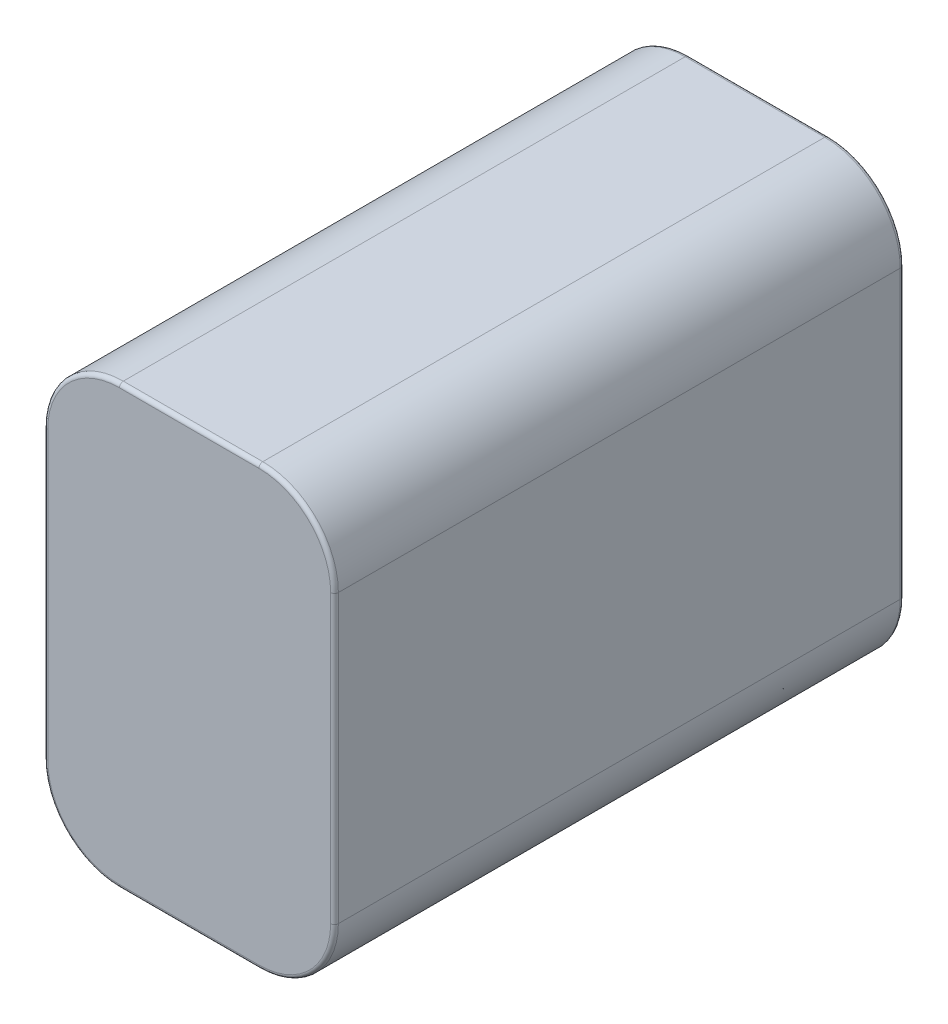
ISO-10303-21;
HEADER;
FILE_DESCRIPTION(('STEP AP214'),'2;1');
FILE_NAME('part.step','',(''),(''),'','','');
FILE_SCHEMA(('AUTOMOTIVE_DESIGN { 1 0 10303 214 1 1 1 1 }'));
ENDSEC;
DATA;
#1=APPLICATION_CONTEXT('core data for automotive mechanical design processes');
#2=APPLICATION_PROTOCOL_DEFINITION('international standard','automotive_design',2000,#1);
#3=PRODUCT_CONTEXT('',#1,'mechanical');
#4=PRODUCT('Part','Part','',(#3));
#5=PRODUCT_RELATED_PRODUCT_CATEGORY('part','',(#4));
#6=PRODUCT_DEFINITION_FORMATION('','',#4);
#7=PRODUCT_DEFINITION_CONTEXT('part definition',#1,'design');
#8=PRODUCT_DEFINITION('design','',#6,#7);
#9=PRODUCT_DEFINITION_SHAPE('','',#8);
#10=(LENGTH_UNIT() NAMED_UNIT(*) SI_UNIT(.MILLI.,.METRE.));
#11=(NAMED_UNIT(*) PLANE_ANGLE_UNIT() SI_UNIT($,.RADIAN.));
#12=(NAMED_UNIT(*) SI_UNIT($,.STERADIAN.) SOLID_ANGLE_UNIT());
#13=UNCERTAINTY_MEASURE_WITH_UNIT(LENGTH_MEASURE(1.E-05),#10,'distance_accuracy_value','');
#14=(GEOMETRIC_REPRESENTATION_CONTEXT(3) GLOBAL_UNCERTAINTY_ASSIGNED_CONTEXT((#13)) GLOBAL_UNIT_ASSIGNED_CONTEXT((#10,
#11,#12)) REPRESENTATION_CONTEXT('',''));
#15=CARTESIAN_POINT('',(0.,0.,0.));
#16=DIRECTION('',(0.,0.,1.));
#17=DIRECTION('',(1.,0.,0.));
#18=AXIS2_PLACEMENT_3D('',#15,#16,#17);
#19=CARTESIAN_POINT('',(0.,18.5,0.75));
#20=DIRECTION('',(0.,0.,-1.));
#21=DIRECTION('',(-1.,0.,0.));
#22=AXIS2_PLACEMENT_3D('',#19,#20,#21);
#23=CYLINDRICAL_SURFACE('',#22,9.75);
#24=DIRECTION('',(0.,0.,-1.));
#25=VECTOR('',#24,1.);
#26=CARTESIAN_POINT('',(-9.75000000000001,18.5,0.75));
#27=LINE('',#26,#25);
#28=CARTESIAN_POINT('',(-9.75000000000001,18.5,0.25));
#29=VERTEX_POINT('',#28);
#30=CARTESIAN_POINT('',(-9.75000000000001,18.5,-72.25));
#31=VERTEX_POINT('',#30);
#32=EDGE_CURVE('E281',#29,#31,#27,.T.);
#33=ORIENTED_EDGE('',*,*,#32,.F.);
#34=CARTESIAN_POINT('',(0.,18.5,0.25));
#35=DIRECTION('',(0.,0.,-1.));
#36=DIRECTION('',(-1.,0.,0.));
#37=AXIS2_PLACEMENT_3D('',#34,#35,#36);
#38=CIRCLE('',#37,9.75);
#39=CARTESIAN_POINT('',(0.,28.25,0.25));
#40=VERTEX_POINT('',#39);
#41=EDGE_CURVE('E333',#29,#40,#38,.T.);
#42=ORIENTED_EDGE('',*,*,#41,.T.);
#43=DIRECTION('',(0.,0.,-1.));
#44=VECTOR('',#43,1.);
#45=CARTESIAN_POINT('',(0.,28.25,0.75));
#46=LINE('',#45,#44);
#47=CARTESIAN_POINT('',(0.,28.25,-72.25));
#48=VERTEX_POINT('',#47);
#49=EDGE_CURVE('E260',#40,#48,#46,.T.);
#50=ORIENTED_EDGE('',*,*,#49,.T.);
#51=CARTESIAN_POINT('',(0.,18.5,-72.25));
#52=DIRECTION('',(0.,0.,-1.));
#53=DIRECTION('',(-1.,0.,0.));
#54=AXIS2_PLACEMENT_3D('',#51,#52,#53);
#55=CIRCLE('',#54,9.75);
#56=EDGE_CURVE('E331',#48,#31,#55,.F.);
#57=ORIENTED_EDGE('',*,*,#56,.T.);
#58=EDGE_LOOP('',(#33,#42,#50,#57));
#59=FACE_BOUND('',#58,.T.);
#60=ADVANCED_FACE('F37',(#59),#23,.T.);
#61=CARTESIAN_POINT('',(-9.75000000000001,-18.5,0.75));
#62=DIRECTION('',(1.,0.,0.));
#63=DIRECTION('',(0.,0.,-1.));
#64=AXIS2_PLACEMENT_3D('',#61,#62,#63);
#65=PLANE('',#64);
#66=DIRECTION('',(0.,0.,-1.));
#67=VECTOR('',#66,1.);
#68=CARTESIAN_POINT('',(-9.75000000000001,-18.5,0.75));
#69=LINE('',#68,#67);
#70=CARTESIAN_POINT('',(-9.75000000000001,-18.5,0.25));
#71=VERTEX_POINT('',#70);
#72=CARTESIAN_POINT('',(-9.75000000000001,-18.5,-72.25));
#73=VERTEX_POINT('',#72);
#74=EDGE_CURVE('E278',#71,#73,#69,.T.);
#75=ORIENTED_EDGE('',*,*,#74,.F.);
#76=DIRECTION('',(0.,-1.,0.));
#77=VECTOR('',#76,1.);
#78=CARTESIAN_POINT('',(-9.75000000000001,-18.5,0.25));
#79=LINE('',#78,#77);
#80=EDGE_CURVE('E329',#71,#29,#79,.F.);
#81=ORIENTED_EDGE('',*,*,#80,.T.);
#82=ORIENTED_EDGE('',*,*,#32,.T.);
#83=DIRECTION('',(0.,1.,0.));
#84=VECTOR('',#83,1.);
#85=CARTESIAN_POINT('',(-9.75000000000001,-18.5,-72.25));
#86=LINE('',#85,#84);
#87=EDGE_CURVE('E327',#31,#73,#86,.F.);
#88=ORIENTED_EDGE('',*,*,#87,.T.);
#89=EDGE_LOOP('',(#75,#81,#82,#88));
#90=FACE_BOUND('',#89,.T.);
#91=ADVANCED_FACE('F407',(#90),#65,.F.);
#92=CARTESIAN_POINT('',(0.,-18.5,0.75));
#93=DIRECTION('',(0.,0.,-1.));
#94=DIRECTION('',(-1.,0.,0.));
#95=AXIS2_PLACEMENT_3D('',#92,#93,#94);
#96=CYLINDRICAL_SURFACE('',#95,9.75);
#97=DIRECTION('',(0.,0.,-1.));
#98=VECTOR('',#97,1.);
#99=CARTESIAN_POINT('',(0.,-28.25,0.75));
#100=LINE('',#99,#98);
#101=CARTESIAN_POINT('',(0.,-28.25,0.25));
#102=VERTEX_POINT('',#101);
#103=CARTESIAN_POINT('',(0.,-28.25,-72.25));
#104=VERTEX_POINT('',#103);
#105=EDGE_CURVE('E275',#102,#104,#100,.T.);
#106=ORIENTED_EDGE('',*,*,#105,.F.);
#107=CARTESIAN_POINT('',(0.,-18.5,0.25));
#108=DIRECTION('',(0.,0.,-1.));
#109=DIRECTION('',(-1.,0.,0.));
#110=AXIS2_PLACEMENT_3D('',#107,#108,#109);
#111=CIRCLE('',#110,9.75);
#112=EDGE_CURVE('E325',#102,#71,#111,.T.);
#113=ORIENTED_EDGE('',*,*,#112,.T.);
#114=ORIENTED_EDGE('',*,*,#74,.T.);
#115=CARTESIAN_POINT('',(0.,-18.5,-72.25));
#116=DIRECTION('',(0.,0.,-1.));
#117=DIRECTION('',(-1.,0.,0.));
#118=AXIS2_PLACEMENT_3D('',#115,#116,#117);
#119=CIRCLE('',#118,9.75);
#120=EDGE_CURVE('E323',#73,#104,#119,.F.);
#121=ORIENTED_EDGE('',*,*,#120,.T.);
#122=EDGE_LOOP('',(#106,#113,#114,#121));
#123=FACE_BOUND('',#122,.T.);
#124=ADVANCED_FACE('F467',(#123),#96,.T.);
#125=CARTESIAN_POINT('',(0.,-28.25,0.75));
#126=DIRECTION('',(0.,1.,0.));
#127=DIRECTION('',(0.,0.,1.));
#128=AXIS2_PLACEMENT_3D('',#125,#126,#127);
#129=PLANE('',#128);
#130=DIRECTION('',(0.,0.,-1.));
#131=VECTOR('',#130,1.);
#132=CARTESIAN_POINT('',(18.,-28.25,0.75));
#133=LINE('',#132,#131);
#134=CARTESIAN_POINT('',(18.,-28.25,0.25));
#135=VERTEX_POINT('',#134);
#136=CARTESIAN_POINT('',(18.,-28.25,-72.25));
#137=VERTEX_POINT('',#136);
#138=EDGE_CURVE('E272',#135,#137,#133,.T.);
#139=ORIENTED_EDGE('',*,*,#138,.F.);
#140=DIRECTION('',(1.,0.,0.));
#141=VECTOR('',#140,1.);
#142=CARTESIAN_POINT('',(0.,-28.25,0.25));
#143=LINE('',#142,#141);
#144=EDGE_CURVE('E321',#135,#102,#143,.F.);
#145=ORIENTED_EDGE('',*,*,#144,.T.);
#146=ORIENTED_EDGE('',*,*,#105,.T.);
#147=DIRECTION('',(-1.,0.,0.));
#148=VECTOR('',#147,1.);
#149=CARTESIAN_POINT('',(18.,-28.25,-72.25));
#150=LINE('',#149,#148);
#151=EDGE_CURVE('E319',#104,#137,#150,.F.);
#152=ORIENTED_EDGE('',*,*,#151,.T.);
#153=EDGE_LOOP('',(#139,#145,#146,#152));
#154=FACE_BOUND('',#153,.T.);
#155=ADVANCED_FACE('F455',(#154),#129,.F.);
#156=CARTESIAN_POINT('',(18.,-18.5,0.75));
#157=DIRECTION('',(0.,0.,-1.));
#158=DIRECTION('',(-1.,0.,0.));
#159=AXIS2_PLACEMENT_3D('',#156,#157,#158);
#160=CYLINDRICAL_SURFACE('',#159,9.75);
#161=DIRECTION('',(0.,0.,-1.));
#162=VECTOR('',#161,1.);
#163=CARTESIAN_POINT('',(27.75,-18.5,0.75));
#164=LINE('',#163,#162);
#165=CARTESIAN_POINT('',(27.75,-18.5,0.25));
#166=VERTEX_POINT('',#165);
#167=CARTESIAN_POINT('',(27.75,-18.5,-72.25));
#168=VERTEX_POINT('',#167);
#169=EDGE_CURVE('E269',#166,#168,#164,.T.);
#170=ORIENTED_EDGE('',*,*,#169,.F.);
#171=CARTESIAN_POINT('',(18.,-18.5,0.25));
#172=DIRECTION('',(0.,0.,-1.));
#173=DIRECTION('',(-1.,0.,0.));
#174=AXIS2_PLACEMENT_3D('',#171,#172,#173);
#175=CIRCLE('',#174,9.75);
#176=EDGE_CURVE('E317',#166,#135,#175,.T.);
#177=ORIENTED_EDGE('',*,*,#176,.T.);
#178=ORIENTED_EDGE('',*,*,#138,.T.);
#179=CARTESIAN_POINT('',(18.,-18.5,-72.25));
#180=DIRECTION('',(0.,0.,-1.));
#181=DIRECTION('',(-1.,0.,0.));
#182=AXIS2_PLACEMENT_3D('',#179,#180,#181);
#183=CIRCLE('',#182,9.75);
#184=EDGE_CURVE('E314',#137,#168,#183,.F.);
#185=ORIENTED_EDGE('',*,*,#184,.T.);
#186=EDGE_LOOP('',(#170,#177,#178,#185));
#187=FACE_BOUND('',#186,.T.);
#188=ADVANCED_FACE('F451',(#187),#160,.T.);
#189=CARTESIAN_POINT('',(27.75,-18.5,0.75));
#190=DIRECTION('',(-1.,0.,0.));
#191=DIRECTION('',(0.,-1.,0.));
#192=AXIS2_PLACEMENT_3D('',#189,#190,#191);
#193=PLANE('',#192);
#194=DIRECTION('',(0.,0.,-1.));
#195=VECTOR('',#194,1.);
#196=CARTESIAN_POINT('',(27.75,18.5,0.75));
#197=LINE('',#196,#195);
#198=CARTESIAN_POINT('',(27.75,18.5,0.25));
#199=VERTEX_POINT('',#198);
#200=CARTESIAN_POINT('',(27.75,18.5,-72.25));
#201=VERTEX_POINT('',#200);
#202=EDGE_CURVE('E266',#199,#201,#197,.T.);
#203=ORIENTED_EDGE('',*,*,#202,.F.);
#204=DIRECTION('',(0.,1.,0.));
#205=VECTOR('',#204,1.);
#206=CARTESIAN_POINT('',(27.75,-18.5,0.25));
#207=LINE('',#206,#205);
#208=EDGE_CURVE('E312',#199,#166,#207,.F.);
#209=ORIENTED_EDGE('',*,*,#208,.T.);
#210=ORIENTED_EDGE('',*,*,#169,.T.);
#211=DIRECTION('',(0.,-1.,0.));
#212=VECTOR('',#211,1.);
#213=CARTESIAN_POINT('',(27.75,18.5,-72.25));
#214=LINE('',#213,#212);
#215=EDGE_CURVE('E310',#168,#201,#214,.F.);
#216=ORIENTED_EDGE('',*,*,#215,.T.);
#217=EDGE_LOOP('',(#203,#209,#210,#216));
#218=FACE_BOUND('',#217,.T.);
#219=ADVANCED_FACE('F437',(#218),#193,.F.);
#220=CARTESIAN_POINT('',(18.,18.5,0.75));
#221=DIRECTION('',(0.,0.,-1.));
#222=DIRECTION('',(-1.,0.,0.));
#223=AXIS2_PLACEMENT_3D('',#220,#221,#222);
#224=CYLINDRICAL_SURFACE('',#223,9.75);
#225=DIRECTION('',(0.,0.,-1.));
#226=VECTOR('',#225,1.);
#227=CARTESIAN_POINT('',(18.,28.25,0.75));
#228=LINE('',#227,#226);
#229=CARTESIAN_POINT('',(18.,28.25,0.25));
#230=VERTEX_POINT('',#229);
#231=CARTESIAN_POINT('',(18.,28.25,-72.25));
#232=VERTEX_POINT('',#231);
#233=EDGE_CURVE('E263',#230,#232,#228,.T.);
#234=ORIENTED_EDGE('',*,*,#233,.F.);
#235=CARTESIAN_POINT('',(18.,18.5,0.25));
#236=DIRECTION('',(0.,0.,-1.));
#237=DIRECTION('',(-1.,0.,0.));
#238=AXIS2_PLACEMENT_3D('',#235,#236,#237);
#239=CIRCLE('',#238,9.75);
#240=EDGE_CURVE('E308',#230,#199,#239,.T.);
#241=ORIENTED_EDGE('',*,*,#240,.T.);
#242=ORIENTED_EDGE('',*,*,#202,.T.);
#243=CARTESIAN_POINT('',(18.,18.5,-72.25));
#244=DIRECTION('',(0.,0.,-1.));
#245=DIRECTION('',(-1.,0.,0.));
#246=AXIS2_PLACEMENT_3D('',#243,#244,#245);
#247=CIRCLE('',#246,9.75);
#248=EDGE_CURVE('E306',#201,#232,#247,.F.);
#249=ORIENTED_EDGE('',*,*,#248,.T.);
#250=EDGE_LOOP('',(#234,#241,#242,#249));
#251=FACE_BOUND('',#250,.T.);
#252=ADVANCED_FACE('F433',(#251),#224,.T.);
#253=CARTESIAN_POINT('',(0.,28.25,0.75));
#254=DIRECTION('',(0.,-1.,0.));
#255=DIRECTION('',(0.,0.,-1.));
#256=AXIS2_PLACEMENT_3D('',#253,#254,#255);
#257=PLANE('',#256);
#258=ORIENTED_EDGE('',*,*,#49,.F.);
#259=DIRECTION('',(-1.,0.,0.));
#260=VECTOR('',#259,1.);
#261=CARTESIAN_POINT('',(0.,28.25,0.25));
#262=LINE('',#261,#260);
#263=EDGE_CURVE('E303',#40,#230,#262,.F.);
#264=ORIENTED_EDGE('',*,*,#263,.T.);
#265=ORIENTED_EDGE('',*,*,#233,.T.);
#266=DIRECTION('',(1.,0.,0.));
#267=VECTOR('',#266,1.);
#268=CARTESIAN_POINT('',(0.,28.25,-72.25));
#269=LINE('',#268,#267);
#270=EDGE_CURVE('E301',#232,#48,#269,.F.);
#271=ORIENTED_EDGE('',*,*,#270,.T.);
#272=EDGE_LOOP('',(#258,#264,#265,#271));
#273=FACE_BOUND('',#272,.T.);
#274=ADVANCED_FACE('F420',(#273),#257,.F.);
#275=CARTESIAN_POINT('',(0.,18.5,0.75));
#276=DIRECTION('',(0.,0.,-1.));
#277=DIRECTION('',(-1.,0.,0.));
#278=AXIS2_PLACEMENT_3D('',#275,#276,#277);
#279=PLANE('',#278);
#280=CARTESIAN_POINT('',(18.,18.5,0.75));
#281=DIRECTION('',(0.,0.,-1.));
#282=DIRECTION('',(-1.,0.,0.));
#283=AXIS2_PLACEMENT_3D('',#280,#281,#282);
#284=CIRCLE('',#283,9.25);
#285=CARTESIAN_POINT('',(27.25,18.5,0.75));
#286=VERTEX_POINT('',#285);
#287=CARTESIAN_POINT('',(18.,27.75,0.75));
#288=VERTEX_POINT('',#287);
#289=EDGE_CURVE('E296',#286,#288,#284,.F.);
#290=ORIENTED_EDGE('',*,*,#289,.T.);
#291=DIRECTION('',(-1.,0.,0.));
#292=VECTOR('',#291,1.);
#293=CARTESIAN_POINT('',(0.,27.75,0.75));
#294=LINE('',#293,#292);
#295=CARTESIAN_POINT('',(0.,27.75,0.75));
#296=VERTEX_POINT('',#295);
#297=EDGE_CURVE('E298',#288,#296,#294,.T.);
#298=ORIENTED_EDGE('',*,*,#297,.T.);
#299=CARTESIAN_POINT('',(0.,18.5,0.75));
#300=DIRECTION('',(0.,0.,-1.));
#301=DIRECTION('',(-1.,0.,0.));
#302=AXIS2_PLACEMENT_3D('',#299,#300,#301);
#303=CIRCLE('',#302,9.25);
#304=CARTESIAN_POINT('',(-9.25000000000001,18.5,0.75));
#305=VERTEX_POINT('',#304);
#306=EDGE_CURVE('E284',#296,#305,#303,.F.);
#307=ORIENTED_EDGE('',*,*,#306,.T.);
#308=DIRECTION('',(0.,-1.,0.));
#309=VECTOR('',#308,1.);
#310=CARTESIAN_POINT('',(-9.25000000000001,18.5,0.75));
#311=LINE('',#310,#309);
#312=CARTESIAN_POINT('',(-9.25000000000001,-18.5,0.75));
#313=VERTEX_POINT('',#312);
#314=EDGE_CURVE('E286',#305,#313,#311,.T.);
#315=ORIENTED_EDGE('',*,*,#314,.T.);
#316=CARTESIAN_POINT('',(0.,-18.5,0.75));
#317=DIRECTION('',(0.,0.,-1.));
#318=DIRECTION('',(-1.,0.,0.));
#319=AXIS2_PLACEMENT_3D('',#316,#317,#318);
#320=CIRCLE('',#319,9.25);
#321=CARTESIAN_POINT('',(0.,-27.75,0.75));
#322=VERTEX_POINT('',#321);
#323=EDGE_CURVE('E288',#313,#322,#320,.F.);
#324=ORIENTED_EDGE('',*,*,#323,.T.);
#325=DIRECTION('',(1.,0.,0.));
#326=VECTOR('',#325,1.);
#327=CARTESIAN_POINT('',(0.,-27.75,0.75));
#328=LINE('',#327,#326);
#329=CARTESIAN_POINT('',(18.,-27.75,0.75));
#330=VERTEX_POINT('',#329);
#331=EDGE_CURVE('E290',#322,#330,#328,.T.);
#332=ORIENTED_EDGE('',*,*,#331,.T.);
#333=CARTESIAN_POINT('',(18.,-18.5,0.75));
#334=DIRECTION('',(0.,0.,-1.));
#335=DIRECTION('',(-1.,0.,0.));
#336=AXIS2_PLACEMENT_3D('',#333,#334,#335);
#337=CIRCLE('',#336,9.25);
#338=CARTESIAN_POINT('',(27.25,-18.5,0.75));
#339=VERTEX_POINT('',#338);
#340=EDGE_CURVE('E292',#330,#339,#337,.F.);
#341=ORIENTED_EDGE('',*,*,#340,.T.);
#342=DIRECTION('',(0.,1.,0.));
#343=VECTOR('',#342,1.);
#344=CARTESIAN_POINT('',(27.25,18.5,0.75));
#345=LINE('',#344,#343);
#346=EDGE_CURVE('E294',#339,#286,#345,.T.);
#347=ORIENTED_EDGE('',*,*,#346,.T.);
#348=EDGE_LOOP('',(#290,#298,#307,#315,#324,#332,#341,#347));
#349=FACE_BOUND('',#348,.T.);
#350=ADVANCED_FACE('F678',(#349),#279,.F.);
#351=CARTESIAN_POINT('',(0.,18.5,-72.75));
#352=DIRECTION('',(0.,0.,-1.));
#353=DIRECTION('',(-1.,0.,0.));
#354=AXIS2_PLACEMENT_3D('',#351,#352,#353);
#355=PLANE('',#354);
#356=DIRECTION('',(0.,-1.,0.));
#357=VECTOR('',#356,1.);
#358=CARTESIAN_POINT('',(27.25,-18.5,-72.75));
#359=LINE('',#358,#357);
#360=CARTESIAN_POINT('',(27.25,18.5,-72.75));
#361=VERTEX_POINT('',#360);
#362=CARTESIAN_POINT('',(27.25,-18.5,-72.75));
#363=VERTEX_POINT('',#362);
#364=EDGE_CURVE('E47',#361,#363,#359,.T.);
#365=ORIENTED_EDGE('',*,*,#364,.T.);
#366=CARTESIAN_POINT('',(18.,-18.5,-72.75));
#367=DIRECTION('',(0.,0.,-1.));
#368=DIRECTION('',(-1.,0.,0.));
#369=AXIS2_PLACEMENT_3D('',#366,#367,#368);
#370=CIRCLE('',#369,9.25);
#371=CARTESIAN_POINT('',(18.,-27.75,-72.75));
#372=VERTEX_POINT('',#371);
#373=EDGE_CURVE('E12',#363,#372,#370,.T.);
#374=ORIENTED_EDGE('',*,*,#373,.T.);
#375=DIRECTION('',(-1.,0.,0.));
#376=VECTOR('',#375,1.);
#377=CARTESIAN_POINT('',(0.,-27.75,-72.75));
#378=LINE('',#377,#376);
#379=CARTESIAN_POINT('',(0.,-27.75,-72.75));
#380=VERTEX_POINT('',#379);
#381=EDGE_CURVE('E335',#372,#380,#378,.T.);
#382=ORIENTED_EDGE('',*,*,#381,.T.);
#383=CARTESIAN_POINT('',(0.,-18.5,-72.75));
#384=DIRECTION('',(0.,0.,-1.));
#385=DIRECTION('',(-1.,0.,0.));
#386=AXIS2_PLACEMENT_3D('',#383,#384,#385);
#387=CIRCLE('',#386,9.25);
#388=CARTESIAN_POINT('',(-9.25000000000001,-18.5,-72.75));
#389=VERTEX_POINT('',#388);
#390=EDGE_CURVE('E337',#380,#389,#387,.T.);
#391=ORIENTED_EDGE('',*,*,#390,.T.);
#392=DIRECTION('',(0.,1.,0.));
#393=VECTOR('',#392,1.);
#394=CARTESIAN_POINT('',(-9.25000000000001,18.5,-72.75));
#395=LINE('',#394,#393);
#396=CARTESIAN_POINT('',(-9.25000000000001,18.5,-72.75));
#397=VERTEX_POINT('',#396);
#398=EDGE_CURVE('E339',#389,#397,#395,.T.);
#399=ORIENTED_EDGE('',*,*,#398,.T.);
#400=CARTESIAN_POINT('',(0.,18.5,-72.75));
#401=DIRECTION('',(0.,0.,-1.));
#402=DIRECTION('',(-1.,0.,0.));
#403=AXIS2_PLACEMENT_3D('',#400,#401,#402);
#404=CIRCLE('',#403,9.25);
#405=CARTESIAN_POINT('',(0.,27.75,-72.75));
#406=VERTEX_POINT('',#405);
#407=EDGE_CURVE('E341',#397,#406,#404,.T.);
#408=ORIENTED_EDGE('',*,*,#407,.T.);
#409=DIRECTION('',(1.,0.,0.));
#410=VECTOR('',#409,1.);
#411=CARTESIAN_POINT('',(18.,27.75,-72.75));
#412=LINE('',#411,#410);
#413=CARTESIAN_POINT('',(18.,27.75,-72.75));
#414=VERTEX_POINT('',#413);
#415=EDGE_CURVE('E343',#406,#414,#412,.T.);
#416=ORIENTED_EDGE('',*,*,#415,.T.);
#417=CARTESIAN_POINT('',(18.,18.5,-72.75));
#418=DIRECTION('',(0.,0.,-1.));
#419=DIRECTION('',(-1.,0.,0.));
#420=AXIS2_PLACEMENT_3D('',#417,#418,#419);
#421=CIRCLE('',#420,9.25);
#422=EDGE_CURVE('E58',#414,#361,#421,.T.);
#423=ORIENTED_EDGE('',*,*,#422,.T.);
#424=EDGE_LOOP('',(#365,#374,#382,#391,#399,#408,#416,#423));
#425=FACE_BOUND('',#424,.T.);
#426=ADVANCED_FACE('F518',(#425),#355,.T.);
#427=CARTESIAN_POINT('',(0.,-27.75,0.25));
#428=DIRECTION('',(1.,0.,0.));
#429=DIRECTION('',(0.,0.,-1.));
#430=AXIS2_PLACEMENT_3D('',#427,#428,#429);
#431=CYLINDRICAL_SURFACE('',#430,0.5);
#432=CARTESIAN_POINT('',(0.,-27.75,0.25));
#433=DIRECTION('',(-1.,0.,0.));
#434=DIRECTION('',(0.,0.,1.));
#435=AXIS2_PLACEMENT_3D('',#432,#433,#434);
#436=CIRCLE('',#435,0.5);
#437=EDGE_CURVE('E363',#102,#322,#436,.T.);
#438=ORIENTED_EDGE('',*,*,#437,.F.);
#439=ORIENTED_EDGE('',*,*,#144,.F.);
#440=CARTESIAN_POINT('',(18.,-27.75,0.25));
#441=DIRECTION('',(1.,0.,0.));
#442=DIRECTION('',(0.,0.,-1.));
#443=AXIS2_PLACEMENT_3D('',#440,#441,#442);
#444=CIRCLE('',#443,0.5);
#445=EDGE_CURVE('E366',#330,#135,#444,.T.);
#446=ORIENTED_EDGE('',*,*,#445,.F.);
#447=ORIENTED_EDGE('',*,*,#331,.F.);
#448=EDGE_LOOP('',(#438,#439,#446,#447));
#449=FACE_BOUND('',#448,.T.);
#450=ADVANCED_FACE('F460',(#449),#431,.T.);
#451=CARTESIAN_POINT('',(18.,-18.5,0.25));
#452=DIRECTION('',(0.,0.,-1.));
#453=DIRECTION('',(-1.,0.,0.));
#454=AXIS2_PLACEMENT_3D('',#451,#452,#453);
#455=TOROIDAL_SURFACE('',#454,9.25,0.5);
#456=ORIENTED_EDGE('',*,*,#445,.T.);
#457=ORIENTED_EDGE('',*,*,#176,.F.);
#458=CARTESIAN_POINT('',(27.25,-18.5,0.25));
#459=DIRECTION('',(0.,1.,0.));
#460=DIRECTION('',(0.,0.,1.));
#461=AXIS2_PLACEMENT_3D('',#458,#459,#460);
#462=CIRCLE('',#461,0.5);
#463=EDGE_CURVE('E360',#339,#166,#462,.T.);
#464=ORIENTED_EDGE('',*,*,#463,.F.);
#465=ORIENTED_EDGE('',*,*,#340,.F.);
#466=EDGE_LOOP('',(#456,#457,#464,#465));
#467=FACE_BOUND('',#466,.T.);
#468=ADVANCED_FACE('F447',(#467),#455,.T.);
#469=CARTESIAN_POINT('',(0.,-18.5,0.25));
#470=DIRECTION('',(0.,0.,-1.));
#471=DIRECTION('',(-1.,0.,0.));
#472=AXIS2_PLACEMENT_3D('',#469,#470,#471);
#473=TOROIDAL_SURFACE('',#472,9.25,0.5);
#474=ORIENTED_EDGE('',*,*,#437,.T.);
#475=ORIENTED_EDGE('',*,*,#323,.F.);
#476=CARTESIAN_POINT('',(-9.25000000000001,-18.5,0.25));
#477=DIRECTION('',(0.,1.,0.));
#478=DIRECTION('',(0.,0.,1.));
#479=AXIS2_PLACEMENT_3D('',#476,#477,#478);
#480=CIRCLE('',#479,0.5);
#481=EDGE_CURVE('E357',#71,#313,#480,.T.);
#482=ORIENTED_EDGE('',*,*,#481,.F.);
#483=ORIENTED_EDGE('',*,*,#112,.F.);
#484=EDGE_LOOP('',(#474,#475,#482,#483));
#485=FACE_BOUND('',#484,.T.);
#486=ADVANCED_FACE('F465',(#485),#473,.T.);
#487=CARTESIAN_POINT('',(27.25,18.5,0.25));
#488=DIRECTION('',(0.,1.,0.));
#489=DIRECTION('',(-1.,0.,0.));
#490=AXIS2_PLACEMENT_3D('',#487,#488,#489);
#491=CYLINDRICAL_SURFACE('',#490,0.5);
#492=ORIENTED_EDGE('',*,*,#463,.T.);
#493=ORIENTED_EDGE('',*,*,#208,.F.);
#494=CARTESIAN_POINT('',(27.25,18.5,0.25));
#495=DIRECTION('',(0.,1.,0.));
#496=DIRECTION('',(0.,0.,1.));
#497=AXIS2_PLACEMENT_3D('',#494,#495,#496);
#498=CIRCLE('',#497,0.5);
#499=EDGE_CURVE('E354',#286,#199,#498,.T.);
#500=ORIENTED_EDGE('',*,*,#499,.F.);
#501=ORIENTED_EDGE('',*,*,#346,.F.);
#502=EDGE_LOOP('',(#492,#493,#500,#501));
#503=FACE_BOUND('',#502,.T.);
#504=ADVANCED_FACE('F441',(#503),#491,.T.);
#505=CARTESIAN_POINT('',(-9.25000000000001,18.5,0.25));
#506=DIRECTION('',(0.,-1.,0.));
#507=DIRECTION('',(0.,0.,-1.));
#508=AXIS2_PLACEMENT_3D('',#505,#506,#507);
#509=CYLINDRICAL_SURFACE('',#508,0.5);
#510=ORIENTED_EDGE('',*,*,#481,.T.);
#511=ORIENTED_EDGE('',*,*,#314,.F.);
#512=CARTESIAN_POINT('',(-9.25000000000001,18.5,0.25));
#513=DIRECTION('',(0.,1.,0.));
#514=DIRECTION('',(0.,0.,1.));
#515=AXIS2_PLACEMENT_3D('',#512,#513,#514);
#516=CIRCLE('',#515,0.5);
#517=EDGE_CURVE('E351',#29,#305,#516,.T.);
#518=ORIENTED_EDGE('',*,*,#517,.F.);
#519=ORIENTED_EDGE('',*,*,#80,.F.);
#520=EDGE_LOOP('',(#510,#511,#518,#519));
#521=FACE_BOUND('',#520,.T.);
#522=ADVANCED_FACE('F411',(#521),#509,.T.);
#523=CARTESIAN_POINT('',(18.,18.5,0.25));
#524=DIRECTION('',(0.,0.,-1.));
#525=DIRECTION('',(-1.,0.,0.));
#526=AXIS2_PLACEMENT_3D('',#523,#524,#525);
#527=TOROIDAL_SURFACE('',#526,9.25,0.5);
#528=ORIENTED_EDGE('',*,*,#499,.T.);
#529=ORIENTED_EDGE('',*,*,#240,.F.);
#530=CARTESIAN_POINT('',(18.,27.75,0.25));
#531=DIRECTION('',(-1.,0.,0.));
#532=DIRECTION('',(0.,0.,1.));
#533=AXIS2_PLACEMENT_3D('',#530,#531,#532);
#534=CIRCLE('',#533,0.5);
#535=EDGE_CURVE('E349',#288,#230,#534,.T.);
#536=ORIENTED_EDGE('',*,*,#535,.F.);
#537=ORIENTED_EDGE('',*,*,#289,.F.);
#538=EDGE_LOOP('',(#528,#529,#536,#537));
#539=FACE_BOUND('',#538,.T.);
#540=ADVANCED_FACE('F429',(#539),#527,.T.);
#541=CARTESIAN_POINT('',(0.,18.5,0.25));
#542=DIRECTION('',(0.,0.,-1.));
#543=DIRECTION('',(-1.,0.,0.));
#544=AXIS2_PLACEMENT_3D('',#541,#542,#543);
#545=TOROIDAL_SURFACE('',#544,9.25,0.5);
#546=ORIENTED_EDGE('',*,*,#517,.T.);
#547=ORIENTED_EDGE('',*,*,#306,.F.);
#548=CARTESIAN_POINT('',(0.,27.75,0.25));
#549=DIRECTION('',(1.,0.,0.));
#550=DIRECTION('',(0.,0.,-1.));
#551=AXIS2_PLACEMENT_3D('',#548,#549,#550);
#552=CIRCLE('',#551,0.5);
#553=EDGE_CURVE('E347',#40,#296,#552,.T.);
#554=ORIENTED_EDGE('',*,*,#553,.F.);
#555=ORIENTED_EDGE('',*,*,#41,.F.);
#556=EDGE_LOOP('',(#546,#547,#554,#555));
#557=FACE_BOUND('',#556,.T.);
#558=ADVANCED_FACE('F417',(#557),#545,.T.);
#559=CARTESIAN_POINT('',(0.,27.75,0.25));
#560=DIRECTION('',(-1.,0.,0.));
#561=DIRECTION('',(0.,0.,1.));
#562=AXIS2_PLACEMENT_3D('',#559,#560,#561);
#563=CYLINDRICAL_SURFACE('',#562,0.5);
#564=ORIENTED_EDGE('',*,*,#535,.T.);
#565=ORIENTED_EDGE('',*,*,#263,.F.);
#566=ORIENTED_EDGE('',*,*,#553,.T.);
#567=ORIENTED_EDGE('',*,*,#297,.F.);
#568=EDGE_LOOP('',(#564,#565,#566,#567));
#569=FACE_BOUND('',#568,.T.);
#570=ADVANCED_FACE('F423',(#569),#563,.T.);
#571=CARTESIAN_POINT('',(0.,18.5,-72.25));
#572=DIRECTION('',(0.,0.,-1.));
#573=DIRECTION('',(-1.,0.,0.));
#574=AXIS2_PLACEMENT_3D('',#571,#572,#573);
#575=TOROIDAL_SURFACE('',#574,9.25,0.5);
#576=CARTESIAN_POINT('',(-9.25000000000001,18.5,-72.25));
#577=DIRECTION('',(0.,-1.,0.));
#578=DIRECTION('',(0.,0.,-1.));
#579=AXIS2_PLACEMENT_3D('',#576,#577,#578);
#580=CIRCLE('',#579,0.5);
#581=EDGE_CURVE('E385',#31,#397,#580,.T.);
#582=ORIENTED_EDGE('',*,*,#581,.F.);
#583=ORIENTED_EDGE('',*,*,#56,.F.);
#584=CARTESIAN_POINT('',(0.,27.75,-72.25));
#585=DIRECTION('',(1.,0.,0.));
#586=DIRECTION('',(0.,0.,-1.));
#587=AXIS2_PLACEMENT_3D('',#584,#585,#586);
#588=CIRCLE('',#587,0.5);
#589=EDGE_CURVE('E41',#406,#48,#588,.T.);
#590=ORIENTED_EDGE('',*,*,#589,.F.);
#591=ORIENTED_EDGE('',*,*,#407,.F.);
#592=EDGE_LOOP('',(#582,#583,#590,#591));
#593=FACE_BOUND('',#592,.T.);
#594=ADVANCED_FACE('F39',(#593),#575,.T.);
#595=CARTESIAN_POINT('',(0.,27.75,-72.25));
#596=DIRECTION('',(-1.,0.,0.));
#597=DIRECTION('',(0.,0.,1.));
#598=AXIS2_PLACEMENT_3D('',#595,#596,#597);
#599=CYLINDRICAL_SURFACE('',#598,0.5);
#600=ORIENTED_EDGE('',*,*,#589,.T.);
#601=ORIENTED_EDGE('',*,*,#270,.F.);
#602=CARTESIAN_POINT('',(18.,27.75,-72.25));
#603=DIRECTION('',(1.,0.,0.));
#604=DIRECTION('',(0.,0.,-1.));
#605=AXIS2_PLACEMENT_3D('',#602,#603,#604);
#606=CIRCLE('',#605,0.5);
#607=EDGE_CURVE('E383',#414,#232,#606,.T.);
#608=ORIENTED_EDGE('',*,*,#607,.F.);
#609=ORIENTED_EDGE('',*,*,#415,.F.);
#610=EDGE_LOOP('',(#600,#601,#608,#609));
#611=FACE_BOUND('',#610,.T.);
#612=ADVANCED_FACE('F396',(#611),#599,.T.);
#613=CARTESIAN_POINT('',(-9.25000000000001,18.5,-72.25));
#614=DIRECTION('',(0.,-1.,0.));
#615=DIRECTION('',(0.,0.,-1.));
#616=AXIS2_PLACEMENT_3D('',#613,#614,#615);
#617=CYLINDRICAL_SURFACE('',#616,0.5);
#618=ORIENTED_EDGE('',*,*,#581,.T.);
#619=ORIENTED_EDGE('',*,*,#398,.F.);
#620=CARTESIAN_POINT('',(-9.25000000000001,-18.5,-72.25));
#621=DIRECTION('',(0.,-1.,0.));
#622=DIRECTION('',(0.,0.,-1.));
#623=AXIS2_PLACEMENT_3D('',#620,#621,#622);
#624=CIRCLE('',#623,0.5);
#625=EDGE_CURVE('E380',#73,#389,#624,.T.);
#626=ORIENTED_EDGE('',*,*,#625,.F.);
#627=ORIENTED_EDGE('',*,*,#87,.F.);
#628=EDGE_LOOP('',(#618,#619,#626,#627));
#629=FACE_BOUND('',#628,.T.);
#630=ADVANCED_FACE('F486',(#629),#617,.T.);
#631=CARTESIAN_POINT('',(18.,18.5,-72.25));
#632=DIRECTION('',(0.,0.,-1.));
#633=DIRECTION('',(-1.,0.,0.));
#634=AXIS2_PLACEMENT_3D('',#631,#632,#633);
#635=TOROIDAL_SURFACE('',#634,9.25,0.5);
#636=ORIENTED_EDGE('',*,*,#607,.T.);
#637=ORIENTED_EDGE('',*,*,#248,.F.);
#638=CARTESIAN_POINT('',(27.25,18.5,-72.25));
#639=DIRECTION('',(0.,-1.,0.));
#640=DIRECTION('',(0.,0.,-1.));
#641=AXIS2_PLACEMENT_3D('',#638,#639,#640);
#642=CIRCLE('',#641,0.5);
#643=EDGE_CURVE('E377',#361,#201,#642,.T.);
#644=ORIENTED_EDGE('',*,*,#643,.F.);
#645=ORIENTED_EDGE('',*,*,#422,.F.);
#646=EDGE_LOOP('',(#636,#637,#644,#645));
#647=FACE_BOUND('',#646,.T.);
#648=ADVANCED_FACE('F484',(#647),#635,.T.);
#649=CARTESIAN_POINT('',(0.,-18.5,-72.25));
#650=DIRECTION('',(0.,0.,-1.));
#651=DIRECTION('',(-1.,0.,0.));
#652=AXIS2_PLACEMENT_3D('',#649,#650,#651);
#653=TOROIDAL_SURFACE('',#652,9.25,0.5);
#654=ORIENTED_EDGE('',*,*,#625,.T.);
#655=ORIENTED_EDGE('',*,*,#390,.F.);
#656=CARTESIAN_POINT('',(0.,-27.75,-72.25));
#657=DIRECTION('',(1.,0.,0.));
#658=DIRECTION('',(0.,1.,0.));
#659=AXIS2_PLACEMENT_3D('',#656,#657,#658);
#660=CIRCLE('',#659,0.5);
#661=EDGE_CURVE('E374',#104,#380,#660,.T.);
#662=ORIENTED_EDGE('',*,*,#661,.F.);
#663=ORIENTED_EDGE('',*,*,#120,.F.);
#664=EDGE_LOOP('',(#654,#655,#662,#663));
#665=FACE_BOUND('',#664,.T.);
#666=ADVANCED_FACE('F473',(#665),#653,.T.);
#667=CARTESIAN_POINT('',(27.25,18.5,-72.25));
#668=DIRECTION('',(0.,1.,0.));
#669=DIRECTION('',(-1.,0.,0.));
#670=AXIS2_PLACEMENT_3D('',#667,#668,#669);
#671=CYLINDRICAL_SURFACE('',#670,0.5);
#672=ORIENTED_EDGE('',*,*,#643,.T.);
#673=ORIENTED_EDGE('',*,*,#215,.F.);
#674=CARTESIAN_POINT('',(27.25,-18.5,-72.25));
#675=DIRECTION('',(0.,-1.,0.));
#676=DIRECTION('',(0.,0.,-1.));
#677=AXIS2_PLACEMENT_3D('',#674,#675,#676);
#678=CIRCLE('',#677,0.5);
#679=EDGE_CURVE('E372',#363,#168,#678,.T.);
#680=ORIENTED_EDGE('',*,*,#679,.F.);
#681=ORIENTED_EDGE('',*,*,#364,.F.);
#682=EDGE_LOOP('',(#672,#673,#680,#681));
#683=FACE_BOUND('',#682,.T.);
#684=ADVANCED_FACE('F482',(#683),#671,.T.);
#685=CARTESIAN_POINT('',(0.,-27.75,-72.25));
#686=DIRECTION('',(1.,0.,0.));
#687=DIRECTION('',(0.,0.,-1.));
#688=AXIS2_PLACEMENT_3D('',#685,#686,#687);
#689=CYLINDRICAL_SURFACE('',#688,0.5);
#690=ORIENTED_EDGE('',*,*,#661,.T.);
#691=ORIENTED_EDGE('',*,*,#381,.F.);
#692=CARTESIAN_POINT('',(18.,-27.75,-72.25));
#693=DIRECTION('',(1.,0.,0.));
#694=DIRECTION('',(0.,0.,-1.));
#695=AXIS2_PLACEMENT_3D('',#692,#693,#694);
#696=CIRCLE('',#695,0.5);
#697=EDGE_CURVE('E370',#137,#372,#696,.T.);
#698=ORIENTED_EDGE('',*,*,#697,.F.);
#699=ORIENTED_EDGE('',*,*,#151,.F.);
#700=EDGE_LOOP('',(#690,#691,#698,#699));
#701=FACE_BOUND('',#700,.T.);
#702=ADVANCED_FACE('F477',(#701),#689,.T.);
#703=CARTESIAN_POINT('',(18.,-18.5,-72.25));
#704=DIRECTION('',(0.,0.,-1.));
#705=DIRECTION('',(-1.,0.,0.));
#706=AXIS2_PLACEMENT_3D('',#703,#704,#705);
#707=TOROIDAL_SURFACE('',#706,9.25,0.5);
#708=ORIENTED_EDGE('',*,*,#679,.T.);
#709=ORIENTED_EDGE('',*,*,#184,.F.);
#710=ORIENTED_EDGE('',*,*,#697,.T.);
#711=ORIENTED_EDGE('',*,*,#373,.F.);
#712=EDGE_LOOP('',(#708,#709,#710,#711));
#713=FACE_BOUND('',#712,.T.);
#714=ADVANCED_FACE('F480',(#713),#707,.T.);
#715=CLOSED_SHELL('',(#60,#91,#124,#155,#188,#219,#252,#274,#350,#426,#450,#468,#486,#504,#522,
#540,#558,#570,#594,#612,#630,#648,#666,#684,#702,#714));
#716=CARTESIAN_POINT('',(0.,18.5,0.));
#717=DIRECTION('',(0.,0.,-1.));
#718=DIRECTION('',(-1.,0.,0.));
#719=AXIS2_PLACEMENT_3D('',#716,#717,#718);
#720=PLANE('',#719);
#721=DIRECTION('',(1.,0.,0.));
#722=VECTOR('',#721,1.);
#723=CARTESIAN_POINT('',(0.,27.,0.));
#724=LINE('',#723,#722);
#725=CARTESIAN_POINT('',(0.,27.,0.));
#726=VERTEX_POINT('',#725);
#727=CARTESIAN_POINT('',(18.,27.,0.));
#728=VERTEX_POINT('',#727);
#729=EDGE_CURVE('E240',#726,#728,#724,.T.);
#730=ORIENTED_EDGE('',*,*,#729,.T.);
#731=CARTESIAN_POINT('',(18.,18.,0.));
#732=DIRECTION('',(0.,0.,-1.));
#733=DIRECTION('',(-1.,0.,0.));
#734=AXIS2_PLACEMENT_3D('',#731,#732,#733);
#735=CIRCLE('',#734,9.);
#736=CARTESIAN_POINT('',(27.,18.,0.));
#737=VERTEX_POINT('',#736);
#738=EDGE_CURVE('E224',#728,#737,#735,.T.);
#739=ORIENTED_EDGE('',*,*,#738,.T.);
#740=DIRECTION('',(0.,-1.,0.));
#741=VECTOR('',#740,1.);
#742=CARTESIAN_POINT('',(27.,18.,0.));
#743=LINE('',#742,#741);
#744=CARTESIAN_POINT('',(27.,-18.,0.));
#745=VERTEX_POINT('',#744);
#746=EDGE_CURVE('E214',#737,#745,#743,.T.);
#747=ORIENTED_EDGE('',*,*,#746,.T.);
#748=CARTESIAN_POINT('',(18.,-18.,0.));
#749=DIRECTION('',(0.,0.,-1.));
#750=DIRECTION('',(-1.,0.,0.));
#751=AXIS2_PLACEMENT_3D('',#748,#749,#750);
#752=CIRCLE('',#751,9.);
#753=CARTESIAN_POINT('',(18.,-27.,0.));
#754=VERTEX_POINT('',#753);
#755=EDGE_CURVE('E230',#745,#754,#752,.T.);
#756=ORIENTED_EDGE('',*,*,#755,.T.);
#757=DIRECTION('',(-1.,0.,0.));
#758=VECTOR('',#757,1.);
#759=CARTESIAN_POINT('',(18.,-27.,0.));
#760=LINE('',#759,#758);
#761=CARTESIAN_POINT('',(0.,-27.,0.));
#762=VERTEX_POINT('',#761);
#763=EDGE_CURVE('E232',#754,#762,#760,.T.);
#764=ORIENTED_EDGE('',*,*,#763,.T.);
#765=CARTESIAN_POINT('',(0.,-18.,0.));
#766=DIRECTION('',(0.,0.,-1.));
#767=DIRECTION('',(-1.,0.,0.));
#768=AXIS2_PLACEMENT_3D('',#765,#766,#767);
#769=CIRCLE('',#768,9.);
#770=CARTESIAN_POINT('',(-9.,-18.,0.));
#771=VERTEX_POINT('',#770);
#772=EDGE_CURVE('E234',#762,#771,#769,.T.);
#773=ORIENTED_EDGE('',*,*,#772,.T.);
#774=DIRECTION('',(0.,1.,0.));
#775=VECTOR('',#774,1.);
#776=CARTESIAN_POINT('',(-9.,18.,0.));
#777=LINE('',#776,#775);
#778=CARTESIAN_POINT('',(-9.,18.,0.));
#779=VERTEX_POINT('',#778);
#780=EDGE_CURVE('E236',#771,#779,#777,.T.);
#781=ORIENTED_EDGE('',*,*,#780,.T.);
#782=CARTESIAN_POINT('',(0.,18.,0.));
#783=DIRECTION('',(0.,0.,-1.));
#784=DIRECTION('',(-1.,0.,0.));
#785=AXIS2_PLACEMENT_3D('',#782,#783,#784);
#786=CIRCLE('',#785,9.);
#787=EDGE_CURVE('E238',#779,#726,#786,.T.);
#788=ORIENTED_EDGE('',*,*,#787,.T.);
#789=EDGE_LOOP('',(#730,#739,#747,#756,#764,#773,#781,#788));
#790=FACE_BOUND('',#789,.T.);
#791=ADVANCED_FACE('F539',(#790),#720,.T.);
#792=CARTESIAN_POINT('',(27.,18.,-132.812240782915));
#793=DIRECTION('',(-1.,0.,0.));
#794=DIRECTION('',(0.,-1.,0.));
#795=AXIS2_PLACEMENT_3D('',#792,#793,#794);
#796=PLANE('',#795);
#797=DIRECTION('',(0.,0.,1.));
#798=VECTOR('',#797,1.);
#799=CARTESIAN_POINT('',(27.,18.,-132.812240782915));
#800=LINE('',#799,#798);
#801=CARTESIAN_POINT('',(27.,18.,-65.));
#802=VERTEX_POINT('',#801);
#803=EDGE_CURVE('E212',#802,#737,#800,.T.);
#804=ORIENTED_EDGE('',*,*,#803,.F.);
#805=DIRECTION('',(0.,-1.,0.));
#806=VECTOR('',#805,1.);
#807=CARTESIAN_POINT('',(27.,18.,-65.));
#808=LINE('',#807,#806);
#809=CARTESIAN_POINT('',(27.,-18.,-65.));
#810=VERTEX_POINT('',#809);
#811=EDGE_CURVE('E198',#802,#810,#808,.T.);
#812=ORIENTED_EDGE('',*,*,#811,.T.);
#813=DIRECTION('',(0.,0.,1.));
#814=VECTOR('',#813,1.);
#815=CARTESIAN_POINT('',(27.,-18.,-132.812240782915));
#816=LINE('',#815,#814);
#817=EDGE_CURVE('E218',#810,#745,#816,.T.);
#818=ORIENTED_EDGE('',*,*,#817,.T.);
#819=ORIENTED_EDGE('',*,*,#746,.F.);
#820=EDGE_LOOP('',(#804,#812,#818,#819));
#821=FACE_BOUND('',#820,.T.);
#822=ADVANCED_FACE('F213',(#821),#796,.T.);
#823=CARTESIAN_POINT('',(18.,-18.,-132.812240782915));
#824=DIRECTION('',(0.,0.,1.));
#825=DIRECTION('',(1.,0.,0.));
#826=AXIS2_PLACEMENT_3D('',#823,#824,#825);
#827=CYLINDRICAL_SURFACE('',#826,9.);
#828=ORIENTED_EDGE('',*,*,#817,.F.);
#829=CARTESIAN_POINT('',(18.,-18.,-65.));
#830=DIRECTION('',(0.,0.,-1.));
#831=DIRECTION('',(-1.,0.,0.));
#832=AXIS2_PLACEMENT_3D('',#829,#830,#831);
#833=CIRCLE('',#832,9.);
#834=CARTESIAN_POINT('',(18.,-27.,-65.));
#835=VERTEX_POINT('',#834);
#836=EDGE_CURVE('E205',#810,#835,#833,.T.);
#837=ORIENTED_EDGE('',*,*,#836,.T.);
#838=DIRECTION('',(0.,0.,1.));
#839=VECTOR('',#838,1.);
#840=CARTESIAN_POINT('',(18.,-27.,-132.812240782915));
#841=LINE('',#840,#839);
#842=EDGE_CURVE('E255',#835,#754,#841,.T.);
#843=ORIENTED_EDGE('',*,*,#842,.T.);
#844=ORIENTED_EDGE('',*,*,#755,.F.);
#845=EDGE_LOOP('',(#828,#837,#843,#844));
#846=FACE_BOUND('',#845,.T.);
#847=ADVANCED_FACE('F551',(#846),#827,.F.);
#848=CARTESIAN_POINT('',(18.,-27.,-132.812240782915));
#849=DIRECTION('',(0.,1.,0.));
#850=DIRECTION('',(-1.,0.,0.));
#851=AXIS2_PLACEMENT_3D('',#848,#849,#850);
#852=PLANE('',#851);
#853=ORIENTED_EDGE('',*,*,#842,.F.);
#854=DIRECTION('',(-1.,0.,0.));
#855=VECTOR('',#854,1.);
#856=CARTESIAN_POINT('',(18.,-27.,-65.));
#857=LINE('',#856,#855);
#858=CARTESIAN_POINT('',(0.,-27.,-65.));
#859=VERTEX_POINT('',#858);
#860=EDGE_CURVE('E851',#835,#859,#857,.T.);
#861=ORIENTED_EDGE('',*,*,#860,.T.);
#862=DIRECTION('',(0.,0.,1.));
#863=VECTOR('',#862,1.);
#864=CARTESIAN_POINT('',(0.,-27.,-132.812240782915));
#865=LINE('',#864,#863);
#866=EDGE_CURVE('E252',#859,#762,#865,.T.);
#867=ORIENTED_EDGE('',*,*,#866,.T.);
#868=ORIENTED_EDGE('',*,*,#763,.F.);
#869=EDGE_LOOP('',(#853,#861,#867,#868));
#870=FACE_BOUND('',#869,.T.);
#871=ADVANCED_FACE('F558',(#870),#852,.T.);
#872=CARTESIAN_POINT('',(0.,-18.,-132.812240782915));
#873=DIRECTION('',(0.,0.,1.));
#874=DIRECTION('',(1.,0.,0.));
#875=AXIS2_PLACEMENT_3D('',#872,#873,#874);
#876=CYLINDRICAL_SURFACE('',#875,9.);
#877=ORIENTED_EDGE('',*,*,#866,.F.);
#878=CARTESIAN_POINT('',(0.,-18.,-65.));
#879=DIRECTION('',(0.,0.,-1.));
#880=DIRECTION('',(-1.,0.,0.));
#881=AXIS2_PLACEMENT_3D('',#878,#879,#880);
#882=CIRCLE('',#881,9.);
#883=CARTESIAN_POINT('',(-9.,-18.,-65.));
#884=VERTEX_POINT('',#883);
#885=EDGE_CURVE('E846',#859,#884,#882,.T.);
#886=ORIENTED_EDGE('',*,*,#885,.T.);
#887=DIRECTION('',(0.,0.,1.));
#888=VECTOR('',#887,1.);
#889=CARTESIAN_POINT('',(-9.,-18.,-132.812240782915));
#890=LINE('',#889,#888);
#891=EDGE_CURVE('E249',#884,#771,#890,.T.);
#892=ORIENTED_EDGE('',*,*,#891,.T.);
#893=ORIENTED_EDGE('',*,*,#772,.F.);
#894=EDGE_LOOP('',(#877,#886,#892,#893));
#895=FACE_BOUND('',#894,.T.);
#896=ADVANCED_FACE('F566',(#895),#876,.F.);
#897=CARTESIAN_POINT('',(-9.,18.,-132.812240782915));
#898=DIRECTION('',(1.,0.,0.));
#899=DIRECTION('',(0.,1.,0.));
#900=AXIS2_PLACEMENT_3D('',#897,#898,#899);
#901=PLANE('',#900);
#902=ORIENTED_EDGE('',*,*,#891,.F.);
#903=DIRECTION('',(0.,1.,0.));
#904=VECTOR('',#903,1.);
#905=CARTESIAN_POINT('',(-9.,18.,-65.));
#906=LINE('',#905,#904);
#907=CARTESIAN_POINT('',(-9.,18.,-65.));
#908=VERTEX_POINT('',#907);
#909=EDGE_CURVE('E844',#884,#908,#906,.T.);
#910=ORIENTED_EDGE('',*,*,#909,.T.);
#911=DIRECTION('',(0.,0.,1.));
#912=VECTOR('',#911,1.);
#913=CARTESIAN_POINT('',(-9.,18.,-132.812240782915));
#914=LINE('',#913,#912);
#915=EDGE_CURVE('E246',#908,#779,#914,.T.);
#916=ORIENTED_EDGE('',*,*,#915,.T.);
#917=ORIENTED_EDGE('',*,*,#780,.F.);
#918=EDGE_LOOP('',(#902,#910,#916,#917));
#919=FACE_BOUND('',#918,.T.);
#920=ADVANCED_FACE('F574',(#919),#901,.T.);
#921=CARTESIAN_POINT('',(0.,18.,-132.812240782915));
#922=DIRECTION('',(0.,0.,1.));
#923=DIRECTION('',(1.,0.,0.));
#924=AXIS2_PLACEMENT_3D('',#921,#922,#923);
#925=CYLINDRICAL_SURFACE('',#924,9.);
#926=ORIENTED_EDGE('',*,*,#915,.F.);
#927=CARTESIAN_POINT('',(0.,18.,-65.));
#928=DIRECTION('',(0.,0.,-1.));
#929=DIRECTION('',(-1.,0.,0.));
#930=AXIS2_PLACEMENT_3D('',#927,#928,#929);
#931=CIRCLE('',#930,9.);
#932=CARTESIAN_POINT('',(0.,27.,-65.));
#933=VERTEX_POINT('',#932);
#934=EDGE_CURVE('E369',#908,#933,#931,.T.);
#935=ORIENTED_EDGE('',*,*,#934,.T.);
#936=DIRECTION('',(0.,0.,1.));
#937=VECTOR('',#936,1.);
#938=CARTESIAN_POINT('',(0.,27.,-132.812240782915));
#939=LINE('',#938,#937);
#940=EDGE_CURVE('E243',#933,#726,#939,.T.);
#941=ORIENTED_EDGE('',*,*,#940,.T.);
#942=ORIENTED_EDGE('',*,*,#787,.F.);
#943=EDGE_LOOP('',(#926,#935,#941,#942));
#944=FACE_BOUND('',#943,.T.);
#945=ADVANCED_FACE('F582',(#944),#925,.F.);
#946=CARTESIAN_POINT('',(0.,27.,-132.812240782915));
#947=DIRECTION('',(0.,-1.,0.));
#948=DIRECTION('',(0.,0.,-1.));
#949=AXIS2_PLACEMENT_3D('',#946,#947,#948);
#950=PLANE('',#949);
#951=ORIENTED_EDGE('',*,*,#940,.F.);
#952=DIRECTION('',(1.,0.,0.));
#953=VECTOR('',#952,1.);
#954=CARTESIAN_POINT('',(0.,27.,-65.));
#955=LINE('',#954,#953);
#956=CARTESIAN_POINT('',(18.,27.,-65.));
#957=VERTEX_POINT('',#956);
#958=EDGE_CURVE('E217',#933,#957,#955,.T.);
#959=ORIENTED_EDGE('',*,*,#958,.T.);
#960=DIRECTION('',(0.,0.,1.));
#961=VECTOR('',#960,1.);
#962=CARTESIAN_POINT('',(18.,27.,-132.812240782915));
#963=LINE('',#962,#961);
#964=EDGE_CURVE('E222',#957,#728,#963,.T.);
#965=ORIENTED_EDGE('',*,*,#964,.T.);
#966=ORIENTED_EDGE('',*,*,#729,.F.);
#967=EDGE_LOOP('',(#951,#959,#965,#966));
#968=FACE_BOUND('',#967,.T.);
#969=ADVANCED_FACE('F590',(#968),#950,.T.);
#970=CARTESIAN_POINT('',(18.,18.,-132.812240782915));
#971=DIRECTION('',(0.,0.,1.));
#972=DIRECTION('',(1.,0.,0.));
#973=AXIS2_PLACEMENT_3D('',#970,#971,#972);
#974=CYLINDRICAL_SURFACE('',#973,9.);
#975=ORIENTED_EDGE('',*,*,#964,.F.);
#976=CARTESIAN_POINT('',(18.,18.,-65.));
#977=DIRECTION('',(0.,0.,-1.));
#978=DIRECTION('',(-1.,0.,0.));
#979=AXIS2_PLACEMENT_3D('',#976,#977,#978);
#980=CIRCLE('',#979,9.);
#981=EDGE_CURVE('E202',#957,#802,#980,.T.);
#982=ORIENTED_EDGE('',*,*,#981,.T.);
#983=ORIENTED_EDGE('',*,*,#803,.T.);
#984=ORIENTED_EDGE('',*,*,#738,.F.);
#985=EDGE_LOOP('',(#975,#982,#983,#984));
#986=FACE_BOUND('',#985,.T.);
#987=ADVANCED_FACE('F220',(#986),#974,.F.);
#988=CARTESIAN_POINT('',(0.,-18.5,-65.));
#989=DIRECTION('',(0.,0.,-1.));
#990=DIRECTION('',(-1.,0.,0.));
#991=AXIS2_PLACEMENT_3D('',#988,#989,#990);
#992=PLANE('',#991);
#993=ORIENTED_EDGE('',*,*,#981,.F.);
#994=ORIENTED_EDGE('',*,*,#958,.F.);
#995=ORIENTED_EDGE('',*,*,#934,.F.);
#996=ORIENTED_EDGE('',*,*,#909,.F.);
#997=ORIENTED_EDGE('',*,*,#885,.F.);
#998=ORIENTED_EDGE('',*,*,#860,.F.);
#999=ORIENTED_EDGE('',*,*,#836,.F.);
#1000=ORIENTED_EDGE('',*,*,#811,.F.);
#1001=EDGE_LOOP('',(#993,#994,#995,#996,#997,#998,#999,#1000));
#1002=FACE_BOUND('',#1001,.T.);
#1003=ADVANCED_FACE('F200',(#1002),#992,.F.);
#1004=CLOSED_SHELL('',(#791,#822,#847,#871,#896,#920,#945,#969,#987,#1003));
#1005=ORIENTED_CLOSED_SHELL('',*,#1004,.T.);
#1006=BREP_WITH_VOIDS('B2',#715,(#1005));
#1007=ADVANCED_BREP_SHAPE_REPRESENTATION('',(#18,#1006),#14);
#1008=SHAPE_DEFINITION_REPRESENTATION(#9,#1007);
ENDSEC;
END-ISO-10303-21;
